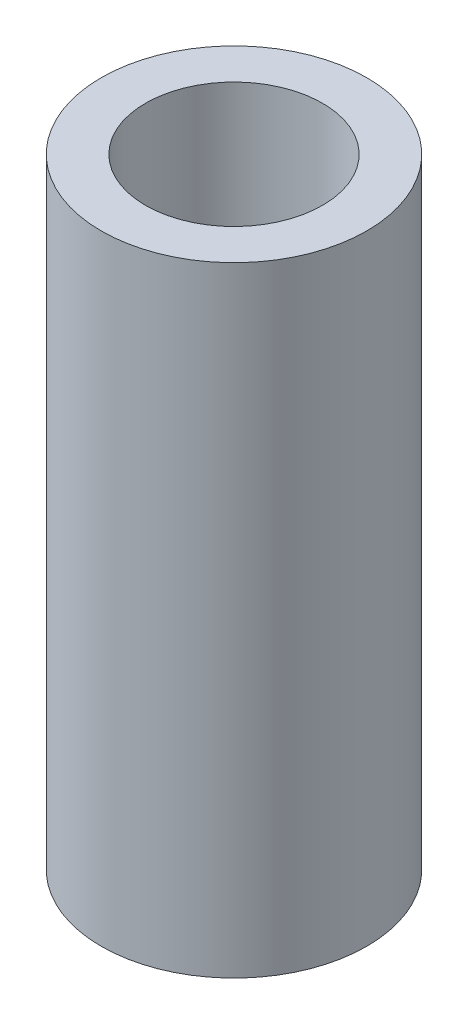
ISO-10303-21;
HEADER;
FILE_DESCRIPTION(('STEP AP214'),'2;1');
FILE_NAME('part.step','',(''),(''),'','','');
FILE_SCHEMA(('AUTOMOTIVE_DESIGN { 1 0 10303 214 1 1 1 1 }'));
ENDSEC;
DATA;
#1=APPLICATION_CONTEXT('core data for automotive mechanical design processes');
#2=APPLICATION_PROTOCOL_DEFINITION('international standard','automotive_design',2000,#1);
#3=PRODUCT_CONTEXT('',#1,'mechanical');
#4=PRODUCT('Part','Part','',(#3));
#5=PRODUCT_RELATED_PRODUCT_CATEGORY('part','',(#4));
#6=PRODUCT_DEFINITION_FORMATION('','',#4);
#7=PRODUCT_DEFINITION_CONTEXT('part definition',#1,'design');
#8=PRODUCT_DEFINITION('design','',#6,#7);
#9=PRODUCT_DEFINITION_SHAPE('','',#8);
#10=(LENGTH_UNIT() NAMED_UNIT(*) SI_UNIT(.MILLI.,.METRE.));
#11=(NAMED_UNIT(*) PLANE_ANGLE_UNIT() SI_UNIT($,.RADIAN.));
#12=(NAMED_UNIT(*) SI_UNIT($,.STERADIAN.) SOLID_ANGLE_UNIT());
#13=UNCERTAINTY_MEASURE_WITH_UNIT(LENGTH_MEASURE(1.E-05),#10,'distance_accuracy_value','');
#14=(GEOMETRIC_REPRESENTATION_CONTEXT(3) GLOBAL_UNCERTAINTY_ASSIGNED_CONTEXT((#13)) GLOBAL_UNIT_ASSIGNED_CONTEXT((#10,
#11,#12)) REPRESENTATION_CONTEXT('',''));
#15=CARTESIAN_POINT('',(0.,0.,0.));
#16=DIRECTION('',(0.,0.,1.));
#17=DIRECTION('',(1.,0.,0.));
#18=AXIS2_PLACEMENT_3D('',#15,#16,#17);
#19=CARTESIAN_POINT('',(0.,-2.68998383093097,0.));
#20=DIRECTION('',(0.,-1.,0.));
#21=DIRECTION('',(0.,0.,-1.));
#22=AXIS2_PLACEMENT_3D('',#19,#20,#21);
#23=CYLINDRICAL_SURFACE('',#22,3.);
#24=CARTESIAN_POINT('',(0.,0.,0.));
#25=DIRECTION('',(0.,-1.,0.));
#26=DIRECTION('',(0.,0.,-1.));
#27=AXIS2_PLACEMENT_3D('',#24,#25,#26);
#28=CIRCLE('',#27,3.);
#29=CARTESIAN_POINT('',(0.,0.,-3.));
#30=VERTEX_POINT('',#29);
#31=EDGE_CURVE('E10',#30,#30,#28,.T.);
#32=ORIENTED_EDGE('',*,*,#31,.F.);
#33=EDGE_LOOP('',(#32));
#34=FACE_BOUND('',#33,.T.);
#35=CARTESIAN_POINT('',(0.,14.,0.));
#36=DIRECTION('',(0.,-1.,0.));
#37=DIRECTION('',(0.,0.,-1.));
#38=AXIS2_PLACEMENT_3D('',#35,#36,#37);
#39=CIRCLE('',#38,3.);
#40=CARTESIAN_POINT('',(0.,14.,-3.));
#41=VERTEX_POINT('',#40);
#42=EDGE_CURVE('E44',#41,#41,#39,.T.);
#43=ORIENTED_EDGE('',*,*,#42,.T.);
#44=EDGE_LOOP('',(#43));
#45=FACE_BOUND('',#44,.T.);
#46=ADVANCED_FACE('F37',(#34,#45),#23,.T.);
#47=CARTESIAN_POINT('',(-3.,0.,0.));
#48=DIRECTION('',(0.,1.,0.));
#49=DIRECTION('',(0.,0.,1.));
#50=AXIS2_PLACEMENT_3D('',#47,#48,#49);
#51=PLANE('',#50);
#52=CARTESIAN_POINT('',(0.,0.,0.));
#53=DIRECTION('',(0.,1.,0.));
#54=DIRECTION('',(0.,0.,1.));
#55=AXIS2_PLACEMENT_3D('',#52,#53,#54);
#56=CIRCLE('',#55,2.);
#57=CARTESIAN_POINT('',(0.,0.,2.));
#58=VERTEX_POINT('',#57);
#59=EDGE_CURVE('E54',#58,#58,#56,.T.);
#60=ORIENTED_EDGE('',*,*,#59,.T.);
#61=EDGE_LOOP('',(#60));
#62=FACE_BOUND('',#61,.T.);
#63=ORIENTED_EDGE('',*,*,#31,.T.);
#64=EDGE_LOOP('',(#63));
#65=FACE_BOUND('',#64,.T.);
#66=ADVANCED_FACE('F61',(#62,#65),#51,.F.);
#67=CARTESIAN_POINT('',(0.,14.,0.));
#68=DIRECTION('',(0.,-1.,0.));
#69=DIRECTION('',(0.,0.,-1.));
#70=AXIS2_PLACEMENT_3D('',#67,#68,#69);
#71=PLANE('',#70);
#72=CARTESIAN_POINT('',(0.,14.,0.));
#73=DIRECTION('',(0.,1.,0.));
#74=DIRECTION('',(0.,0.,1.));
#75=AXIS2_PLACEMENT_3D('',#72,#73,#74);
#76=CIRCLE('',#75,2.);
#77=CARTESIAN_POINT('',(0.,14.,2.));
#78=VERTEX_POINT('',#77);
#79=EDGE_CURVE('E49',#78,#78,#76,.T.);
#80=ORIENTED_EDGE('',*,*,#79,.F.);
#81=EDGE_LOOP('',(#80));
#82=FACE_BOUND('',#81,.T.);
#83=ORIENTED_EDGE('',*,*,#42,.F.);
#84=EDGE_LOOP('',(#83));
#85=FACE_BOUND('',#84,.T.);
#86=ADVANCED_FACE('F65',(#82,#85),#71,.F.);
#87=CARTESIAN_POINT('',(0.,14.,0.));
#88=DIRECTION('',(0.,-1.,0.));
#89=DIRECTION('',(0.,0.,-1.));
#90=AXIS2_PLACEMENT_3D('',#87,#88,#89);
#91=CYLINDRICAL_SURFACE('',#90,2.);
#92=ORIENTED_EDGE('',*,*,#79,.T.);
#93=EDGE_LOOP('',(#92));
#94=FACE_BOUND('',#93,.T.);
#95=ORIENTED_EDGE('',*,*,#59,.F.);
#96=EDGE_LOOP('',(#95));
#97=FACE_BOUND('',#96,.T.);
#98=ADVANCED_FACE('F63',(#94,#97),#91,.F.);
#99=CLOSED_SHELL('',(#46,#66,#86,#98));
#100=MANIFOLD_SOLID_BREP('B2',#99);
#101=ADVANCED_BREP_SHAPE_REPRESENTATION('',(#18,#100),#14);
#102=SHAPE_DEFINITION_REPRESENTATION(#9,#101);
ENDSEC;
END-ISO-10303-21;
